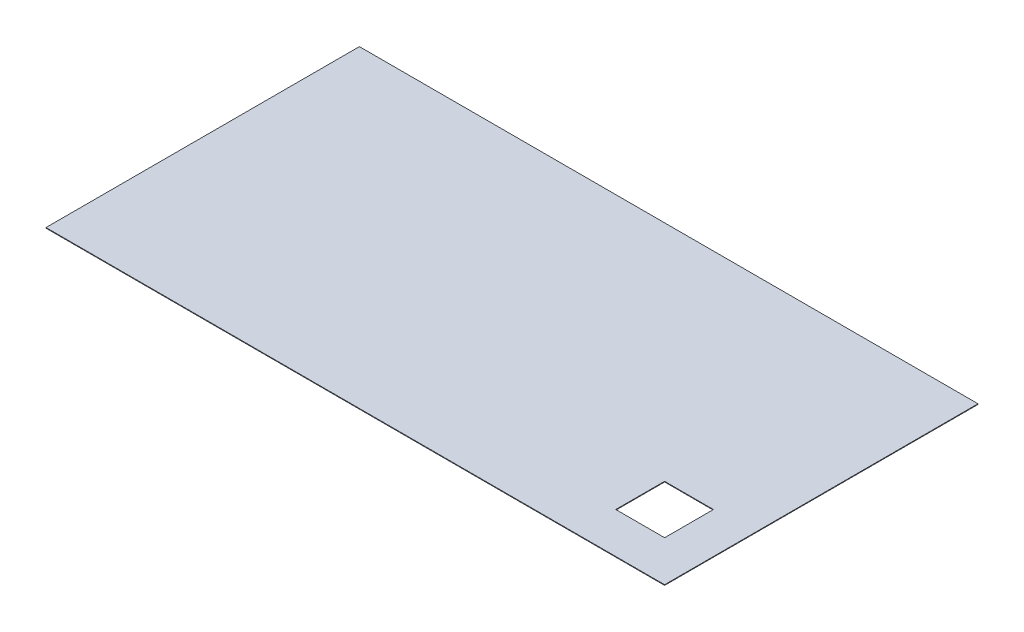
ISO-10303-21;
HEADER;
FILE_DESCRIPTION(('STEP AP214'),'2;1');
FILE_NAME('part.step','',(''),(''),'','','');
FILE_SCHEMA(('AUTOMOTIVE_DESIGN { 1 0 10303 214 1 1 1 1 }'));
ENDSEC;
DATA;
#1=APPLICATION_CONTEXT('core data for automotive mechanical design processes');
#2=APPLICATION_PROTOCOL_DEFINITION('international standard','automotive_design',2000,#1);
#3=PRODUCT_CONTEXT('',#1,'mechanical');
#4=PRODUCT('Part','Part','',(#3));
#5=PRODUCT_RELATED_PRODUCT_CATEGORY('part','',(#4));
#6=PRODUCT_DEFINITION_FORMATION('','',#4);
#7=PRODUCT_DEFINITION_CONTEXT('part definition',#1,'design');
#8=PRODUCT_DEFINITION('design','',#6,#7);
#9=PRODUCT_DEFINITION_SHAPE('','',#8);
#10=(LENGTH_UNIT() NAMED_UNIT(*) SI_UNIT(.MILLI.,.METRE.));
#11=(NAMED_UNIT(*) PLANE_ANGLE_UNIT() SI_UNIT($,.RADIAN.));
#12=(NAMED_UNIT(*) SI_UNIT($,.STERADIAN.) SOLID_ANGLE_UNIT());
#13=UNCERTAINTY_MEASURE_WITH_UNIT(LENGTH_MEASURE(1.E-05),#10,'distance_accuracy_value','');
#14=(GEOMETRIC_REPRESENTATION_CONTEXT(3) GLOBAL_UNCERTAINTY_ASSIGNED_CONTEXT((#13)) GLOBAL_UNIT_ASSIGNED_CONTEXT((#10,
#11,#12)) REPRESENTATION_CONTEXT('',''));
#15=CARTESIAN_POINT('',(0.,0.,0.));
#16=DIRECTION('',(0.,0.,1.));
#17=DIRECTION('',(1.,0.,0.));
#18=AXIS2_PLACEMENT_3D('',#15,#16,#17);
#19=CARTESIAN_POINT('',(760.,-1.5,385.));
#20=DIRECTION('',(1.,0.,0.));
#21=DIRECTION('',(0.,0.,-1.));
#22=AXIS2_PLACEMENT_3D('',#19,#20,#21);
#23=PLANE('',#22);
#24=DIRECTION('',(0.,0.,-1.));
#25=VECTOR('',#24,1.);
#26=CARTESIAN_POINT('',(760.,0.,385.));
#27=LINE('',#26,#25);
#28=CARTESIAN_POINT('',(760.,0.,385.));
#29=VERTEX_POINT('',#28);
#30=CARTESIAN_POINT('',(760.,0.,-385.));
#31=VERTEX_POINT('',#30);
#32=EDGE_CURVE('E115',#29,#31,#27,.T.);
#33=ORIENTED_EDGE('',*,*,#32,.F.);
#34=DIRECTION('',(0.,1.,0.));
#35=VECTOR('',#34,1.);
#36=CARTESIAN_POINT('',(760.,-1.5,385.));
#37=LINE('',#36,#35);
#38=CARTESIAN_POINT('',(760.,-1.5,385.));
#39=VERTEX_POINT('',#38);
#40=EDGE_CURVE('E11',#39,#29,#37,.T.);
#41=ORIENTED_EDGE('',*,*,#40,.F.);
#42=DIRECTION('',(0.,0.,-1.));
#43=VECTOR('',#42,1.);
#44=CARTESIAN_POINT('',(760.,-1.5,385.));
#45=LINE('',#44,#43);
#46=CARTESIAN_POINT('',(760.,-1.5,-385.));
#47=VERTEX_POINT('',#46);
#48=EDGE_CURVE('E119',#39,#47,#45,.T.);
#49=ORIENTED_EDGE('',*,*,#48,.T.);
#50=DIRECTION('',(0.,1.,0.));
#51=VECTOR('',#50,1.);
#52=CARTESIAN_POINT('',(760.,-1.5,-385.));
#53=LINE('',#52,#51);
#54=EDGE_CURVE('E20',#47,#31,#53,.T.);
#55=ORIENTED_EDGE('',*,*,#54,.T.);
#56=EDGE_LOOP('',(#33,#41,#49,#55));
#57=FACE_BOUND('',#56,.T.);
#58=ADVANCED_FACE('F17',(#57),#23,.T.);
#59=CARTESIAN_POINT('',(-760.,-1.5,385.));
#60=DIRECTION('',(0.,0.,1.));
#61=DIRECTION('',(1.,0.,0.));
#62=AXIS2_PLACEMENT_3D('',#59,#60,#61);
#63=PLANE('',#62);
#64=DIRECTION('',(1.,0.,0.));
#65=VECTOR('',#64,1.);
#66=CARTESIAN_POINT('',(-760.,0.,385.));
#67=LINE('',#66,#65);
#68=CARTESIAN_POINT('',(-760.,0.,385.));
#69=VERTEX_POINT('',#68);
#70=EDGE_CURVE('E123',#69,#29,#67,.T.);
#71=ORIENTED_EDGE('',*,*,#70,.F.);
#72=DIRECTION('',(0.,1.,0.));
#73=VECTOR('',#72,1.);
#74=CARTESIAN_POINT('',(-760.,-1.5,385.));
#75=LINE('',#74,#73);
#76=CARTESIAN_POINT('',(-760.,-1.5,385.));
#77=VERTEX_POINT('',#76);
#78=EDGE_CURVE('E25',#77,#69,#75,.T.);
#79=ORIENTED_EDGE('',*,*,#78,.F.);
#80=DIRECTION('',(1.,0.,0.));
#81=VECTOR('',#80,1.);
#82=CARTESIAN_POINT('',(-760.,-1.5,385.));
#83=LINE('',#82,#81);
#84=EDGE_CURVE('E129',#77,#39,#83,.T.);
#85=ORIENTED_EDGE('',*,*,#84,.T.);
#86=ORIENTED_EDGE('',*,*,#40,.T.);
#87=EDGE_LOOP('',(#71,#79,#85,#86));
#88=FACE_BOUND('',#87,.T.);
#89=ADVANCED_FACE('F153',(#88),#63,.T.);
#90=CARTESIAN_POINT('',(-760.,-1.5,385.));
#91=DIRECTION('',(-1.,0.,0.));
#92=DIRECTION('',(0.,0.,1.));
#93=AXIS2_PLACEMENT_3D('',#90,#91,#92);
#94=PLANE('',#93);
#95=DIRECTION('',(0.,0.,1.));
#96=VECTOR('',#95,1.);
#97=CARTESIAN_POINT('',(-760.,0.,385.));
#98=LINE('',#97,#96);
#99=CARTESIAN_POINT('',(-760.,0.,-385.));
#100=VERTEX_POINT('',#99);
#101=EDGE_CURVE('E137',#100,#69,#98,.T.);
#102=ORIENTED_EDGE('',*,*,#101,.F.);
#103=DIRECTION('',(0.,1.,0.));
#104=VECTOR('',#103,1.);
#105=CARTESIAN_POINT('',(-760.,-1.5,-385.));
#106=LINE('',#105,#104);
#107=CARTESIAN_POINT('',(-760.,-1.5,-385.));
#108=VERTEX_POINT('',#107);
#109=EDGE_CURVE('E142',#108,#100,#106,.T.);
#110=ORIENTED_EDGE('',*,*,#109,.F.);
#111=DIRECTION('',(0.,0.,1.));
#112=VECTOR('',#111,1.);
#113=CARTESIAN_POINT('',(-760.,-1.5,385.));
#114=LINE('',#113,#112);
#115=EDGE_CURVE('E126',#108,#77,#114,.T.);
#116=ORIENTED_EDGE('',*,*,#115,.T.);
#117=ORIENTED_EDGE('',*,*,#78,.T.);
#118=EDGE_LOOP('',(#102,#110,#116,#117));
#119=FACE_BOUND('',#118,.T.);
#120=ADVANCED_FACE('F159',(#119),#94,.T.);
#121=CARTESIAN_POINT('',(-760.,-1.5,-385.));
#122=DIRECTION('',(0.,0.,-1.));
#123=DIRECTION('',(-1.,0.,0.));
#124=AXIS2_PLACEMENT_3D('',#121,#122,#123);
#125=PLANE('',#124);
#126=DIRECTION('',(-1.,0.,0.));
#127=VECTOR('',#126,1.);
#128=CARTESIAN_POINT('',(-760.,0.,-385.));
#129=LINE('',#128,#127);
#130=EDGE_CURVE('E134',#31,#100,#129,.T.);
#131=ORIENTED_EDGE('',*,*,#130,.F.);
#132=ORIENTED_EDGE('',*,*,#54,.F.);
#133=DIRECTION('',(-1.,0.,0.));
#134=VECTOR('',#133,1.);
#135=CARTESIAN_POINT('',(-760.,-1.5,-385.));
#136=LINE('',#135,#134);
#137=EDGE_CURVE('E122',#47,#108,#136,.T.);
#138=ORIENTED_EDGE('',*,*,#137,.T.);
#139=ORIENTED_EDGE('',*,*,#109,.T.);
#140=EDGE_LOOP('',(#131,#132,#138,#139));
#141=FACE_BOUND('',#140,.T.);
#142=ADVANCED_FACE('F150',(#141),#125,.T.);
#143=CARTESIAN_POINT('',(0.,-1.5,0.));
#144=DIRECTION('',(0.,-1.,0.));
#145=DIRECTION('',(0.,0.,-1.));
#146=AXIS2_PLACEMENT_3D('',#143,#144,#145);
#147=PLANE('',#146);
#148=DIRECTION('',(0.,0.,1.));
#149=VECTOR('',#148,1.);
#150=CARTESIAN_POINT('',(660.,-1.5,165.));
#151=LINE('',#150,#149);
#152=CARTESIAN_POINT('',(660.,-1.5,165.));
#153=VERTEX_POINT('',#152);
#154=CARTESIAN_POINT('',(660.,-1.5,285.));
#155=VERTEX_POINT('',#154);
#156=EDGE_CURVE('E33',#153,#155,#151,.T.);
#157=ORIENTED_EDGE('',*,*,#156,.F.);
#158=DIRECTION('',(1.,0.,0.));
#159=VECTOR('',#158,1.);
#160=CARTESIAN_POINT('',(540.,-1.5,165.));
#161=LINE('',#160,#159);
#162=CARTESIAN_POINT('',(540.,-1.5,165.));
#163=VERTEX_POINT('',#162);
#164=EDGE_CURVE('E100',#163,#153,#161,.T.);
#165=ORIENTED_EDGE('',*,*,#164,.F.);
#166=DIRECTION('',(0.,0.,-1.));
#167=VECTOR('',#166,1.);
#168=CARTESIAN_POINT('',(540.,-1.5,165.));
#169=LINE('',#168,#167);
#170=CARTESIAN_POINT('',(540.,-1.5,285.));
#171=VERTEX_POINT('',#170);
#172=EDGE_CURVE('E103',#171,#163,#169,.T.);
#173=ORIENTED_EDGE('',*,*,#172,.F.);
#174=DIRECTION('',(-1.,0.,0.));
#175=VECTOR('',#174,1.);
#176=CARTESIAN_POINT('',(540.,-1.5,285.));
#177=LINE('',#176,#175);
#178=EDGE_CURVE('E109',#155,#171,#177,.T.);
#179=ORIENTED_EDGE('',*,*,#178,.F.);
#180=EDGE_LOOP('',(#157,#165,#173,#179));
#181=FACE_BOUND('',#180,.T.);
#182=ORIENTED_EDGE('',*,*,#48,.F.);
#183=ORIENTED_EDGE('',*,*,#84,.F.);
#184=ORIENTED_EDGE('',*,*,#115,.F.);
#185=ORIENTED_EDGE('',*,*,#137,.F.);
#186=EDGE_LOOP('',(#182,#183,#184,#185));
#187=FACE_BOUND('',#186,.T.);
#188=ADVANCED_FACE('F156',(#181,#187),#147,.T.);
#189=CARTESIAN_POINT('',(0.,0.,0.));
#190=DIRECTION('',(0.,-1.,0.));
#191=DIRECTION('',(0.,0.,-1.));
#192=AXIS2_PLACEMENT_3D('',#189,#190,#191);
#193=PLANE('',#192);
#194=DIRECTION('',(1.,0.,0.));
#195=VECTOR('',#194,1.);
#196=CARTESIAN_POINT('',(540.,0.,165.));
#197=LINE('',#196,#195);
#198=CARTESIAN_POINT('',(540.,0.,165.));
#199=VERTEX_POINT('',#198);
#200=CARTESIAN_POINT('',(660.,0.,165.));
#201=VERTEX_POINT('',#200);
#202=EDGE_CURVE('E90',#199,#201,#197,.T.);
#203=ORIENTED_EDGE('',*,*,#202,.T.);
#204=DIRECTION('',(0.,0.,1.));
#205=VECTOR('',#204,1.);
#206=CARTESIAN_POINT('',(660.,0.,165.));
#207=LINE('',#206,#205);
#208=CARTESIAN_POINT('',(660.,0.,285.));
#209=VERTEX_POINT('',#208);
#210=EDGE_CURVE('E84',#201,#209,#207,.T.);
#211=ORIENTED_EDGE('',*,*,#210,.T.);
#212=DIRECTION('',(-1.,0.,0.));
#213=VECTOR('',#212,1.);
#214=CARTESIAN_POINT('',(540.,0.,285.));
#215=LINE('',#214,#213);
#216=CARTESIAN_POINT('',(540.,0.,285.));
#217=VERTEX_POINT('',#216);
#218=EDGE_CURVE('E93',#209,#217,#215,.T.);
#219=ORIENTED_EDGE('',*,*,#218,.T.);
#220=DIRECTION('',(0.,0.,-1.));
#221=VECTOR('',#220,1.);
#222=CARTESIAN_POINT('',(540.,0.,165.));
#223=LINE('',#222,#221);
#224=EDGE_CURVE('E41',#217,#199,#223,.T.);
#225=ORIENTED_EDGE('',*,*,#224,.T.);
#226=EDGE_LOOP('',(#203,#211,#219,#225));
#227=FACE_BOUND('',#226,.T.);
#228=ORIENTED_EDGE('',*,*,#32,.T.);
#229=ORIENTED_EDGE('',*,*,#130,.T.);
#230=ORIENTED_EDGE('',*,*,#101,.T.);
#231=ORIENTED_EDGE('',*,*,#70,.T.);
#232=EDGE_LOOP('',(#228,#229,#230,#231));
#233=FACE_BOUND('',#232,.T.);
#234=ADVANCED_FACE('F97',(#227,#233),#193,.F.);
#235=CARTESIAN_POINT('',(660.,0.,165.));
#236=DIRECTION('',(1.,0.,0.));
#237=DIRECTION('',(0.,0.,-1.));
#238=AXIS2_PLACEMENT_3D('',#235,#236,#237);
#239=PLANE('',#238);
#240=ORIENTED_EDGE('',*,*,#156,.T.);
#241=DIRECTION('',(0.,-1.,0.));
#242=VECTOR('',#241,1.);
#243=CARTESIAN_POINT('',(660.,0.,285.));
#244=LINE('',#243,#242);
#245=EDGE_CURVE('E80',#209,#155,#244,.T.);
#246=ORIENTED_EDGE('',*,*,#245,.F.);
#247=ORIENTED_EDGE('',*,*,#210,.F.);
#248=DIRECTION('',(0.,-1.,0.));
#249=VECTOR('',#248,1.);
#250=CARTESIAN_POINT('',(660.,0.,165.));
#251=LINE('',#250,#249);
#252=EDGE_CURVE('E113',#201,#153,#251,.T.);
#253=ORIENTED_EDGE('',*,*,#252,.T.);
#254=EDGE_LOOP('',(#240,#246,#247,#253));
#255=FACE_BOUND('',#254,.T.);
#256=ADVANCED_FACE('F82',(#255),#239,.F.);
#257=CARTESIAN_POINT('',(540.,0.,165.));
#258=DIRECTION('',(0.,0.,-1.));
#259=DIRECTION('',(-1.,0.,0.));
#260=AXIS2_PLACEMENT_3D('',#257,#258,#259);
#261=PLANE('',#260);
#262=ORIENTED_EDGE('',*,*,#164,.T.);
#263=ORIENTED_EDGE('',*,*,#252,.F.);
#264=ORIENTED_EDGE('',*,*,#202,.F.);
#265=DIRECTION('',(0.,-1.,0.));
#266=VECTOR('',#265,1.);
#267=CARTESIAN_POINT('',(540.,0.,165.));
#268=LINE('',#267,#266);
#269=EDGE_CURVE('E116',#199,#163,#268,.T.);
#270=ORIENTED_EDGE('',*,*,#269,.T.);
#271=EDGE_LOOP('',(#262,#263,#264,#270));
#272=FACE_BOUND('',#271,.T.);
#273=ADVANCED_FACE('F217',(#272),#261,.F.);
#274=CARTESIAN_POINT('',(540.,0.,165.));
#275=DIRECTION('',(-1.,0.,0.));
#276=DIRECTION('',(0.,0.,1.));
#277=AXIS2_PLACEMENT_3D('',#274,#275,#276);
#278=PLANE('',#277);
#279=ORIENTED_EDGE('',*,*,#172,.T.);
#280=ORIENTED_EDGE('',*,*,#269,.F.);
#281=ORIENTED_EDGE('',*,*,#224,.F.);
#282=DIRECTION('',(0.,-1.,0.));
#283=VECTOR('',#282,1.);
#284=CARTESIAN_POINT('',(540.,0.,285.));
#285=LINE('',#284,#283);
#286=EDGE_CURVE('E89',#217,#171,#285,.T.);
#287=ORIENTED_EDGE('',*,*,#286,.T.);
#288=EDGE_LOOP('',(#279,#280,#281,#287));
#289=FACE_BOUND('',#288,.T.);
#290=ADVANCED_FACE('F226',(#289),#278,.F.);
#291=CARTESIAN_POINT('',(540.,0.,285.));
#292=DIRECTION('',(0.,0.,1.));
#293=DIRECTION('',(1.,0.,0.));
#294=AXIS2_PLACEMENT_3D('',#291,#292,#293);
#295=PLANE('',#294);
#296=ORIENTED_EDGE('',*,*,#178,.T.);
#297=ORIENTED_EDGE('',*,*,#286,.F.);
#298=ORIENTED_EDGE('',*,*,#218,.F.);
#299=ORIENTED_EDGE('',*,*,#245,.T.);
#300=EDGE_LOOP('',(#296,#297,#298,#299));
#301=FACE_BOUND('',#300,.T.);
#302=ADVANCED_FACE('F94',(#301),#295,.F.);
#303=CLOSED_SHELL('',(#58,#89,#120,#142,#188,#234,#256,#273,#290,#302));
#304=MANIFOLD_SOLID_BREP('B1',#303);
#305=ADVANCED_BREP_SHAPE_REPRESENTATION('',(#18,#304),#14);
#306=SHAPE_DEFINITION_REPRESENTATION(#9,#305);
ENDSEC;
END-ISO-10303-21;
